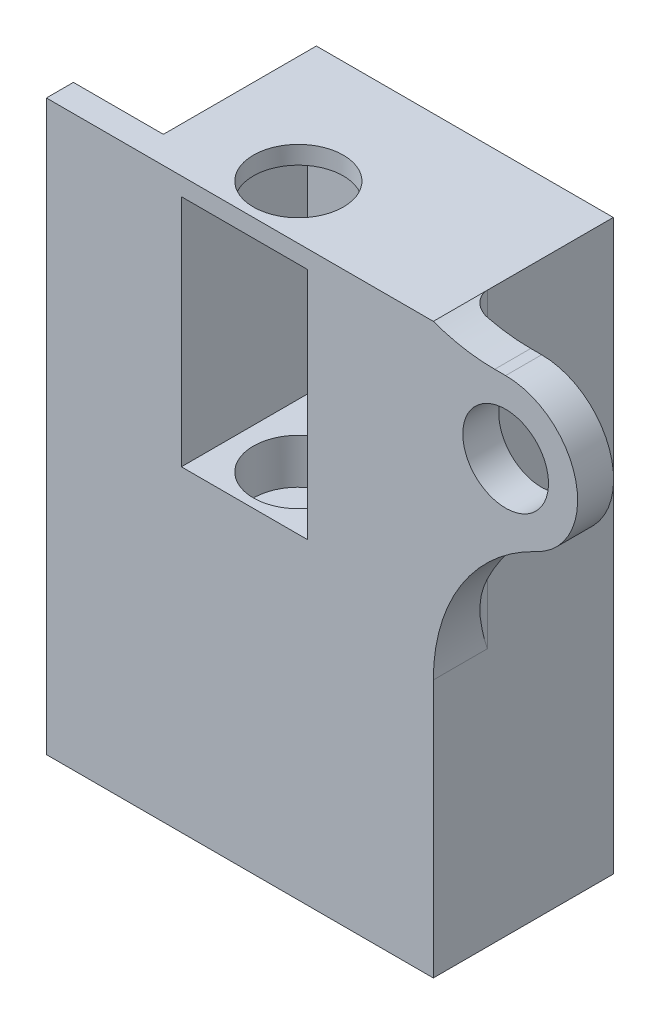
ISO-10303-21;
HEADER;
FILE_DESCRIPTION(('STEP AP214'),'2;1');
FILE_NAME('part.step','',(''),(''),'','','');
FILE_SCHEMA(('AUTOMOTIVE_DESIGN { 1 0 10303 214 1 1 1 1 }'));
ENDSEC;
DATA;
#1=APPLICATION_CONTEXT('core data for automotive mechanical design processes');
#2=APPLICATION_PROTOCOL_DEFINITION('international standard','automotive_design',2000,#1);
#3=PRODUCT_CONTEXT('',#1,'mechanical');
#4=PRODUCT('Part','Part','',(#3));
#5=PRODUCT_RELATED_PRODUCT_CATEGORY('part','',(#4));
#6=PRODUCT_DEFINITION_FORMATION('','',#4);
#7=PRODUCT_DEFINITION_CONTEXT('part definition',#1,'design');
#8=PRODUCT_DEFINITION('design','',#6,#7);
#9=PRODUCT_DEFINITION_SHAPE('','',#8);
#10=(LENGTH_UNIT() NAMED_UNIT(*) SI_UNIT(.MILLI.,.METRE.));
#11=(NAMED_UNIT(*) PLANE_ANGLE_UNIT() SI_UNIT($,.RADIAN.));
#12=(NAMED_UNIT(*) SI_UNIT($,.STERADIAN.) SOLID_ANGLE_UNIT());
#13=UNCERTAINTY_MEASURE_WITH_UNIT(LENGTH_MEASURE(1.E-05),#10,'distance_accuracy_value','');
#14=(GEOMETRIC_REPRESENTATION_CONTEXT(3) GLOBAL_UNCERTAINTY_ASSIGNED_CONTEXT((#13)) GLOBAL_UNIT_ASSIGNED_CONTEXT((#10,
#11,#12)) REPRESENTATION_CONTEXT('',''));
#15=CARTESIAN_POINT('',(0.,0.,0.));
#16=DIRECTION('',(0.,0.,1.));
#17=DIRECTION('',(1.,0.,0.));
#18=AXIS2_PLACEMENT_3D('',#15,#16,#17);
#19=CARTESIAN_POINT('',(0.,0.,0.));
#20=DIRECTION('',(1.,0.,0.));
#21=DIRECTION('',(0.,0.,-1.));
#22=AXIS2_PLACEMENT_3D('',#19,#20,#21);
#23=PLANE('',#22);
#24=DIRECTION('',(0.,0.,1.));
#25=VECTOR('',#24,1.);
#26=CARTESIAN_POINT('',(0.,33.6,-12.));
#27=LINE('',#26,#25);
#28=CARTESIAN_POINT('',(0.,33.6,-10.));
#29=VERTEX_POINT('',#28);
#30=CARTESIAN_POINT('',(0.,33.6,-1.5));
#31=VERTEX_POINT('',#30);
#32=EDGE_CURVE('E636',#29,#31,#27,.T.);
#33=ORIENTED_EDGE('',*,*,#32,.F.);
#34=DIRECTION('',(0.,1.,0.));
#35=VECTOR('',#34,1.);
#36=CARTESIAN_POINT('',(0.,33.6,-10.));
#37=LINE('',#36,#35);
#38=CARTESIAN_POINT('',(0.,2.,-10.));
#39=VERTEX_POINT('',#38);
#40=EDGE_CURVE('E61',#39,#29,#37,.T.);
#41=ORIENTED_EDGE('',*,*,#40,.F.);
#42=DIRECTION('',(0.,0.,1.));
#43=VECTOR('',#42,1.);
#44=CARTESIAN_POINT('',(0.,2.,-12.));
#45=LINE('',#44,#43);
#46=CARTESIAN_POINT('',(0.,2.,-1.5));
#47=VERTEX_POINT('',#46);
#48=EDGE_CURVE('E170',#39,#47,#45,.T.);
#49=ORIENTED_EDGE('',*,*,#48,.T.);
#50=DIRECTION('',(0.,-1.,0.));
#51=VECTOR('',#50,1.);
#52=CARTESIAN_POINT('',(0.,37.1,-1.5));
#53=LINE('',#52,#51);
#54=EDGE_CURVE('E553',#31,#47,#53,.T.);
#55=ORIENTED_EDGE('',*,*,#54,.F.);
#56=EDGE_LOOP('',(#33,#41,#49,#55));
#57=FACE_BOUND('',#56,.T.);
#58=ADVANCED_FACE('F40',(#57),#23,.F.);
#59=CARTESIAN_POINT('',(16.5,0.,0.));
#60=DIRECTION('',(0.,0.,-1.));
#61=DIRECTION('',(-1.,0.,0.));
#62=AXIS2_PLACEMENT_3D('',#59,#60,#61);
#63=PLANE('',#62);
#64=DIRECTION('',(-1.,0.,0.));
#65=VECTOR('',#64,1.);
#66=CARTESIAN_POINT('',(0.,32.6,0.));
#67=LINE('',#66,#65);
#68=CARTESIAN_POINT('',(9.5,32.6,0.));
#69=VERTEX_POINT('',#68);
#70=CARTESIAN_POINT('',(2.5,32.6,0.));
#71=VERTEX_POINT('',#70);
#72=EDGE_CURVE('E596',#69,#71,#67,.T.);
#73=ORIENTED_EDGE('',*,*,#72,.F.);
#74=DIRECTION('',(0.,1.,0.));
#75=VECTOR('',#74,1.);
#76=CARTESIAN_POINT('',(9.5,0.,0.));
#77=LINE('',#76,#75);
#78=CARTESIAN_POINT('',(9.5,19.6,0.));
#79=VERTEX_POINT('',#78);
#80=EDGE_CURVE('E576',#79,#69,#77,.T.);
#81=ORIENTED_EDGE('',*,*,#80,.F.);
#82=DIRECTION('',(1.,0.,0.));
#83=VECTOR('',#82,1.);
#84=CARTESIAN_POINT('',(0.,19.6,0.));
#85=LINE('',#84,#83);
#86=CARTESIAN_POINT('',(2.5,19.6,0.));
#87=VERTEX_POINT('',#86);
#88=EDGE_CURVE('E582',#87,#79,#85,.T.);
#89=ORIENTED_EDGE('',*,*,#88,.F.);
#90=DIRECTION('',(0.,-1.,0.));
#91=VECTOR('',#90,1.);
#92=CARTESIAN_POINT('',(2.50000000000001,0.,0.));
#93=LINE('',#92,#91);
#94=EDGE_CURVE('E600',#71,#87,#93,.T.);
#95=ORIENTED_EDGE('',*,*,#94,.F.);
#96=EDGE_LOOP('',(#73,#81,#89,#95));
#97=FACE_BOUND('',#96,.T.);
#98=CARTESIAN_POINT('',(20.5182193377738,29.,0.));
#99=DIRECTION('',(0.,0.,-1.));
#100=DIRECTION('',(-1.,0.,0.));
#101=AXIS2_PLACEMENT_3D('',#98,#99,#100);
#102=CIRCLE('',#101,2.38125);
#103=CARTESIAN_POINT('',(18.1369693377738,29.,0.));
#104=VERTEX_POINT('',#103);
#105=EDGE_CURVE('E519',#104,#104,#102,.T.);
#106=ORIENTED_EDGE('',*,*,#105,.T.);
#107=EDGE_LOOP('',(#106));
#108=FACE_BOUND('',#107,.T.);
#109=DIRECTION('',(-1.,0.,0.));
#110=VECTOR('',#109,1.);
#111=CARTESIAN_POINT('',(0.,33.,0.));
#112=LINE('',#111,#110);
#113=CARTESIAN_POINT('',(20.5182193377738,33.,0.));
#114=VERTEX_POINT('',#113);
#115=CARTESIAN_POINT('',(19.9117444218464,33.,0.));
#116=VERTEX_POINT('',#115);
#117=EDGE_CURVE('E528',#114,#116,#112,.T.);
#118=ORIENTED_EDGE('',*,*,#117,.T.);
#119=CARTESIAN_POINT('',(19.9117444218464,43.,0.));
#120=DIRECTION('',(0.,0.,-1.));
#121=DIRECTION('',(-1.,0.,0.));
#122=AXIS2_PLACEMENT_3D('',#119,#120,#121);
#123=CIRCLE('',#122,10.);
#124=CARTESIAN_POINT('',(16.5,33.6,0.));
#125=VERTEX_POINT('',#124);
#126=EDGE_CURVE('E206',#116,#125,#123,.T.);
#127=ORIENTED_EDGE('',*,*,#126,.T.);
#128=DIRECTION('',(1.,0.,0.));
#129=VECTOR('',#128,1.);
#130=CARTESIAN_POINT('',(-5.,33.6,0.));
#131=LINE('',#130,#129);
#132=CARTESIAN_POINT('',(-5.,33.6,0.));
#133=VERTEX_POINT('',#132);
#134=EDGE_CURVE('E555',#133,#125,#131,.T.);
#135=ORIENTED_EDGE('',*,*,#134,.F.);
#136=DIRECTION('',(0.,1.,0.));
#137=VECTOR('',#136,1.);
#138=CARTESIAN_POINT('',(-5.,2.,0.));
#139=LINE('',#138,#137);
#140=CARTESIAN_POINT('',(-5.,2.,0.));
#141=VERTEX_POINT('',#140);
#142=EDGE_CURVE('E559',#141,#133,#139,.T.);
#143=ORIENTED_EDGE('',*,*,#142,.F.);
#144=DIRECTION('',(1.,0.,0.));
#145=VECTOR('',#144,1.);
#146=CARTESIAN_POINT('',(0.,2.,0.));
#147=LINE('',#146,#145);
#148=CARTESIAN_POINT('',(16.5,2.,0.));
#149=VERTEX_POINT('',#148);
#150=EDGE_CURVE('E183',#141,#149,#147,.T.);
#151=ORIENTED_EDGE('',*,*,#150,.T.);
#152=DIRECTION('',(0.,-1.,0.));
#153=VECTOR('',#152,1.);
#154=CARTESIAN_POINT('',(16.5,0.,0.));
#155=LINE('',#154,#153);
#156=CARTESIAN_POINT('',(16.5,16.342263231169,0.));
#157=VERTEX_POINT('',#156);
#158=EDGE_CURVE('E176',#157,#149,#155,.T.);
#159=ORIENTED_EDGE('',*,*,#158,.F.);
#160=CARTESIAN_POINT('',(26.5,16.342263231169,0.));
#161=DIRECTION('',(0.,0.,-1.));
#162=DIRECTION('',(-1.,0.,0.));
#163=AXIS2_PLACEMENT_3D('',#160,#161,#162);
#164=CIRCLE('',#163,10.);
#165=CARTESIAN_POINT('',(22.2272995269813,25.383503780334,0.));
#166=VERTEX_POINT('',#165);
#167=EDGE_CURVE('E218',#157,#166,#164,.T.);
#168=ORIENTED_EDGE('',*,*,#167,.T.);
#169=CARTESIAN_POINT('',(20.5182193377738,29.,0.));
#170=DIRECTION('',(0.,0.,1.));
#171=DIRECTION('',(1.,0.,0.));
#172=AXIS2_PLACEMENT_3D('',#169,#170,#171);
#173=CIRCLE('',#172,4.);
#174=EDGE_CURVE('E523',#114,#166,#173,.F.);
#175=ORIENTED_EDGE('',*,*,#174,.F.);
#176=EDGE_LOOP('',(#118,#127,#135,#143,#151,#159,#168,#175));
#177=FACE_BOUND('',#176,.T.);
#178=ADVANCED_FACE('F246',(#97,#108,#177),#63,.F.);
#179=CARTESIAN_POINT('',(16.5,0.,0.));
#180=DIRECTION('',(1.,0.,0.));
#181=DIRECTION('',(0.,0.,-1.));
#182=AXIS2_PLACEMENT_3D('',#179,#180,#181);
#183=PLANE('',#182);
#184=DIRECTION('',(0.,-1.,0.));
#185=VECTOR('',#184,1.);
#186=CARTESIAN_POINT('',(16.5,2.,-10.));
#187=LINE('',#186,#185);
#188=CARTESIAN_POINT('',(16.5,33.6,-10.));
#189=VERTEX_POINT('',#188);
#190=CARTESIAN_POINT('',(16.5,2.,-10.));
#191=VERTEX_POINT('',#190);
#192=EDGE_CURVE('E155',#189,#191,#187,.T.);
#193=ORIENTED_EDGE('',*,*,#192,.F.);
#194=DIRECTION('',(0.,0.,-1.));
#195=VECTOR('',#194,1.);
#196=CARTESIAN_POINT('',(16.5,33.6,0.));
#197=LINE('',#196,#195);
#198=CARTESIAN_POINT('',(16.5,33.6,-3.));
#199=VERTEX_POINT('',#198);
#200=EDGE_CURVE('E548',#199,#189,#197,.T.);
#201=ORIENTED_EDGE('',*,*,#200,.F.);
#202=DIRECTION('',(0.,1.,0.));
#203=VECTOR('',#202,1.);
#204=CARTESIAN_POINT('',(16.5,0.,-3.));
#205=LINE('',#204,#203);
#206=CARTESIAN_POINT('',(16.5,16.342263231169,-3.));
#207=VERTEX_POINT('',#206);
#208=EDGE_CURVE('E229',#199,#207,#205,.F.);
#209=ORIENTED_EDGE('',*,*,#208,.T.);
#210=DIRECTION('',(0.,0.,1.));
#211=VECTOR('',#210,1.);
#212=CARTESIAN_POINT('',(16.5,16.342263231169,0.));
#213=LINE('',#212,#211);
#214=EDGE_CURVE('E212',#207,#157,#213,.T.);
#215=ORIENTED_EDGE('',*,*,#214,.T.);
#216=ORIENTED_EDGE('',*,*,#158,.T.);
#217=DIRECTION('',(0.,0.,1.));
#218=VECTOR('',#217,1.);
#219=CARTESIAN_POINT('',(16.5,2.,-12.));
#220=LINE('',#219,#218);
#221=EDGE_CURVE('E167',#191,#149,#220,.T.);
#222=ORIENTED_EDGE('',*,*,#221,.F.);
#223=EDGE_LOOP('',(#193,#201,#209,#215,#216,#222));
#224=FACE_BOUND('',#223,.T.);
#225=ADVANCED_FACE('F173',(#224),#183,.T.);
#226=CARTESIAN_POINT('',(0.,2.,-12.));
#227=DIRECTION('',(0.,1.,0.));
#228=DIRECTION('',(0.,0.,1.));
#229=AXIS2_PLACEMENT_3D('',#226,#227,#228);
#230=PLANE('',#229);
#231=CARTESIAN_POINT('',(8.25,2.,-6.));
#232=DIRECTION('',(0.,-1.,0.));
#233=DIRECTION('',(0.,0.,-1.));
#234=AXIS2_PLACEMENT_3D('',#231,#232,#233);
#235=CIRCLE('',#234,2.38125);
#236=CARTESIAN_POINT('',(8.25,2.,-8.38125));
#237=VERTEX_POINT('',#236);
#238=EDGE_CURVE('E502',#237,#237,#235,.T.);
#239=ORIENTED_EDGE('',*,*,#238,.F.);
#240=EDGE_LOOP('',(#239));
#241=FACE_BOUND('',#240,.T.);
#242=ORIENTED_EDGE('',*,*,#48,.F.);
#243=DIRECTION('',(-1.,0.,0.));
#244=VECTOR('',#243,1.);
#245=CARTESIAN_POINT('',(0.,2.,-10.));
#246=LINE('',#245,#244);
#247=EDGE_CURVE('E158',#191,#39,#246,.T.);
#248=ORIENTED_EDGE('',*,*,#247,.F.);
#249=ORIENTED_EDGE('',*,*,#221,.T.);
#250=ORIENTED_EDGE('',*,*,#150,.F.);
#251=DIRECTION('',(0.,0.,1.));
#252=VECTOR('',#251,1.);
#253=CARTESIAN_POINT('',(-5.,2.,-1.5));
#254=LINE('',#253,#252);
#255=CARTESIAN_POINT('',(-5.,2.,-1.5));
#256=VERTEX_POINT('',#255);
#257=EDGE_CURVE('E566',#256,#141,#254,.T.);
#258=ORIENTED_EDGE('',*,*,#257,.F.);
#259=DIRECTION('',(1.,0.,0.));
#260=VECTOR('',#259,1.);
#261=CARTESIAN_POINT('',(-5.,2.,-1.5));
#262=LINE('',#261,#260);
#263=EDGE_CURVE('E570',#256,#47,#262,.T.);
#264=ORIENTED_EDGE('',*,*,#263,.T.);
#265=EDGE_LOOP('',(#242,#248,#249,#250,#258,#264));
#266=FACE_BOUND('',#265,.T.);
#267=ADVANCED_FACE('F166',(#241,#266),#230,.F.);
#268=CARTESIAN_POINT('',(20.5182193377738,29.,-2.));
#269=DIRECTION('',(0.,0.,1.));
#270=DIRECTION('',(1.,0.,0.));
#271=AXIS2_PLACEMENT_3D('',#268,#269,#270);
#272=CYLINDRICAL_SURFACE('',#271,4.);
#273=ORIENTED_EDGE('',*,*,#174,.T.);
#274=DIRECTION('',(0.,0.,1.));
#275=VECTOR('',#274,1.);
#276=CARTESIAN_POINT('',(22.2272995269813,25.383503780334,-2.));
#277=LINE('',#276,#275);
#278=CARTESIAN_POINT('',(22.2272995269813,25.383503780334,-2.));
#279=VERTEX_POINT('',#278);
#280=EDGE_CURVE('E215',#166,#279,#277,.F.);
#281=ORIENTED_EDGE('',*,*,#280,.T.);
#282=CARTESIAN_POINT('',(20.5182193377738,29.,-2.));
#283=DIRECTION('',(0.,0.,1.));
#284=DIRECTION('',(1.,0.,0.));
#285=AXIS2_PLACEMENT_3D('',#282,#283,#284);
#286=CIRCLE('',#285,4.);
#287=CARTESIAN_POINT('',(20.5182193377738,33.,-2.));
#288=VERTEX_POINT('',#287);
#289=EDGE_CURVE('E524',#288,#279,#286,.F.);
#290=ORIENTED_EDGE('',*,*,#289,.F.);
#291=DIRECTION('',(0.,0.,1.));
#292=VECTOR('',#291,1.);
#293=CARTESIAN_POINT('',(20.5182193377738,33.,-2.));
#294=LINE('',#293,#292);
#295=EDGE_CURVE('E179',#288,#114,#294,.T.);
#296=ORIENTED_EDGE('',*,*,#295,.T.);
#297=EDGE_LOOP('',(#273,#281,#290,#296));
#298=FACE_BOUND('',#297,.T.);
#299=ADVANCED_FACE('F269',(#298),#272,.T.);
#300=CARTESIAN_POINT('',(0.,33.,-2.));
#301=DIRECTION('',(0.,1.,0.));
#302=DIRECTION('',(0.,0.,1.));
#303=AXIS2_PLACEMENT_3D('',#300,#301,#302);
#304=PLANE('',#303);
#305=DIRECTION('',(-1.,0.,0.));
#306=VECTOR('',#305,1.);
#307=CARTESIAN_POINT('',(0.,33.,-2.));
#308=LINE('',#307,#306);
#309=CARTESIAN_POINT('',(19.9117444218464,33.,-2.));
#310=VERTEX_POINT('',#309);
#311=EDGE_CURVE('E185',#288,#310,#308,.T.);
#312=ORIENTED_EDGE('',*,*,#311,.T.);
#313=DIRECTION('',(0.,0.,1.));
#314=VECTOR('',#313,1.);
#315=CARTESIAN_POINT('',(19.9117444218464,33.,0.));
#316=LINE('',#315,#314);
#317=EDGE_CURVE('E192',#310,#116,#316,.T.);
#318=ORIENTED_EDGE('',*,*,#317,.T.);
#319=ORIENTED_EDGE('',*,*,#117,.F.);
#320=ORIENTED_EDGE('',*,*,#295,.F.);
#321=EDGE_LOOP('',(#312,#318,#319,#320));
#322=FACE_BOUND('',#321,.T.);
#323=ADVANCED_FACE('F273',(#322),#304,.T.);
#324=CARTESIAN_POINT('',(0.,0.,-2.));
#325=DIRECTION('',(0.,0.,1.));
#326=DIRECTION('',(1.,0.,0.));
#327=AXIS2_PLACEMENT_3D('',#324,#325,#326);
#328=PLANE('',#327);
#329=CARTESIAN_POINT('',(20.5182193377738,29.,-2.));
#330=DIRECTION('',(0.,0.,-1.));
#331=DIRECTION('',(-1.,0.,0.));
#332=AXIS2_PLACEMENT_3D('',#329,#330,#331);
#333=CIRCLE('',#332,2.38125);
#334=CARTESIAN_POINT('',(18.1369693377738,29.,-2.));
#335=VERTEX_POINT('',#334);
#336=EDGE_CURVE('E514',#335,#335,#333,.T.);
#337=ORIENTED_EDGE('',*,*,#336,.F.);
#338=EDGE_LOOP('',(#337));
#339=FACE_BOUND('',#338,.T.);
#340=CARTESIAN_POINT('',(26.5,16.342263231169,-2.));
#341=DIRECTION('',(0.,0.,1.));
#342=DIRECTION('',(1.,0.,0.));
#343=AXIS2_PLACEMENT_3D('',#340,#341,#342);
#344=CIRCLE('',#343,10.);
#345=CARTESIAN_POINT('',(17.5,20.7011621747097,-2.));
#346=VERTEX_POINT('',#345);
#347=EDGE_CURVE('E221',#279,#346,#344,.T.);
#348=ORIENTED_EDGE('',*,*,#347,.T.);
#349=DIRECTION('',(0.,1.,0.));
#350=VECTOR('',#349,1.);
#351=CARTESIAN_POINT('',(17.5,0.,-2.));
#352=LINE('',#351,#350);
#353=CARTESIAN_POINT('',(17.5,33.2951821839,-2.));
#354=VERTEX_POINT('',#353);
#355=EDGE_CURVE('E225',#346,#354,#352,.T.);
#356=ORIENTED_EDGE('',*,*,#355,.T.);
#357=CARTESIAN_POINT('',(19.9117444218464,43.,-2.));
#358=DIRECTION('',(0.,0.,1.));
#359=DIRECTION('',(1.,0.,0.));
#360=AXIS2_PLACEMENT_3D('',#357,#358,#359);
#361=CIRCLE('',#360,10.);
#362=EDGE_CURVE('E209',#354,#310,#361,.T.);
#363=ORIENTED_EDGE('',*,*,#362,.T.);
#364=ORIENTED_EDGE('',*,*,#311,.F.);
#365=ORIENTED_EDGE('',*,*,#289,.T.);
#366=EDGE_LOOP('',(#348,#356,#363,#364,#365));
#367=FACE_BOUND('',#366,.T.);
#368=ADVANCED_FACE('F277',(#339,#367),#328,.F.);
#369=CARTESIAN_POINT('',(20.5182193377738,29.,10.6066017177982));
#370=DIRECTION('',(0.,0.,-1.));
#371=DIRECTION('',(-1.,0.,0.));
#372=AXIS2_PLACEMENT_3D('',#369,#370,#371);
#373=CYLINDRICAL_SURFACE('',#372,2.38125);
#374=ORIENTED_EDGE('',*,*,#336,.T.);
#375=EDGE_LOOP('',(#374));
#376=FACE_BOUND('',#375,.T.);
#377=ORIENTED_EDGE('',*,*,#105,.F.);
#378=EDGE_LOOP('',(#377));
#379=FACE_BOUND('',#378,.T.);
#380=ADVANCED_FACE('F281',(#376,#379),#373,.F.);
#381=CARTESIAN_POINT('',(8.25,8.35,-6.));
#382=DIRECTION('',(0.,-1.,0.));
#383=DIRECTION('',(0.,0.,-1.));
#384=AXIS2_PLACEMENT_3D('',#381,#382,#383);
#385=CYLINDRICAL_SURFACE('',#384,2.38125);
#386=CARTESIAN_POINT('',(8.25,8.35,-6.));
#387=DIRECTION('',(0.,-1.,0.));
#388=DIRECTION('',(0.,0.,-1.));
#389=AXIS2_PLACEMENT_3D('',#386,#387,#388);
#390=CIRCLE('',#389,2.38125);
#391=CARTESIAN_POINT('',(8.25,8.35,-8.38125));
#392=VERTEX_POINT('',#391);
#393=EDGE_CURVE('E506',#392,#392,#390,.T.);
#394=ORIENTED_EDGE('',*,*,#393,.F.);
#395=EDGE_LOOP('',(#394));
#396=FACE_BOUND('',#395,.T.);
#397=ORIENTED_EDGE('',*,*,#238,.T.);
#398=EDGE_LOOP('',(#397));
#399=FACE_BOUND('',#398,.T.);
#400=ADVANCED_FACE('F285',(#396,#399),#385,.F.);
#401=CARTESIAN_POINT('',(0.,8.35,0.));
#402=DIRECTION('',(0.,-1.,0.));
#403=DIRECTION('',(0.,0.,-1.));
#404=AXIS2_PLACEMENT_3D('',#401,#402,#403);
#405=PLANE('',#404);
#406=ORIENTED_EDGE('',*,*,#393,.T.);
#407=EDGE_LOOP('',(#406));
#408=FACE_BOUND('',#407,.T.);
#409=ADVANCED_FACE('F289',(#408),#405,.T.);
#410=CARTESIAN_POINT('',(6.,17.1,-3.));
#411=DIRECTION('',(0.,1.,0.));
#412=DIRECTION('',(0.,0.,1.));
#413=AXIS2_PLACEMENT_3D('',#410,#411,#412);
#414=CYLINDRICAL_SURFACE('',#413,2.5);
#415=CARTESIAN_POINT('',(6.,33.6,-3.));
#416=DIRECTION('',(0.,-1.,0.));
#417=DIRECTION('',(0.,0.,-1.));
#418=AXIS2_PLACEMENT_3D('',#415,#416,#417);
#419=CIRCLE('',#418,2.5);
#420=CARTESIAN_POINT('',(6.,33.6,-5.5));
#421=VERTEX_POINT('',#420);
#422=EDGE_CURVE('E547',#421,#421,#419,.F.);
#423=ORIENTED_EDGE('',*,*,#422,.T.);
#424=EDGE_LOOP('',(#423));
#425=FACE_BOUND('',#424,.T.);
#426=CARTESIAN_POINT('',(6.,32.6,-3.));
#427=DIRECTION('',(0.,1.,0.));
#428=DIRECTION('',(0.,0.,1.));
#429=AXIS2_PLACEMENT_3D('',#426,#427,#428);
#430=CIRCLE('',#429,2.5);
#431=CARTESIAN_POINT('',(6.,32.6,-0.5));
#432=VERTEX_POINT('',#431);
#433=EDGE_CURVE('E193',#432,#432,#430,.F.);
#434=ORIENTED_EDGE('',*,*,#433,.T.);
#435=EDGE_LOOP('',(#434));
#436=FACE_BOUND('',#435,.T.);
#437=ADVANCED_FACE('F293',(#425,#436),#414,.F.);
#438=CARTESIAN_POINT('',(0.,19.6,-7.));
#439=DIRECTION('',(0.,-1.,0.));
#440=DIRECTION('',(0.,0.,-1.));
#441=AXIS2_PLACEMENT_3D('',#438,#439,#440);
#442=PLANE('',#441);
#443=ORIENTED_EDGE('',*,*,#88,.T.);
#444=DIRECTION('',(0.,0.,1.));
#445=VECTOR('',#444,1.);
#446=CARTESIAN_POINT('',(9.5,19.6,-7.));
#447=LINE('',#446,#445);
#448=CARTESIAN_POINT('',(9.5,19.6,-7.));
#449=VERTEX_POINT('',#448);
#450=EDGE_CURVE('E198',#449,#79,#447,.T.);
#451=ORIENTED_EDGE('',*,*,#450,.F.);
#452=DIRECTION('',(1.,0.,0.));
#453=VECTOR('',#452,1.);
#454=CARTESIAN_POINT('',(0.,19.6,-7.));
#455=LINE('',#454,#453);
#456=CARTESIAN_POINT('',(2.5,19.6,-7.));
#457=VERTEX_POINT('',#456);
#458=EDGE_CURVE('E590',#457,#449,#455,.T.);
#459=ORIENTED_EDGE('',*,*,#458,.F.);
#460=DIRECTION('',(0.,0.,1.));
#461=VECTOR('',#460,1.);
#462=CARTESIAN_POINT('',(2.5,19.6,-7.));
#463=LINE('',#462,#461);
#464=EDGE_CURVE('E609',#457,#87,#463,.T.);
#465=ORIENTED_EDGE('',*,*,#464,.T.);
#466=EDGE_LOOP('',(#443,#451,#459,#465));
#467=FACE_BOUND('',#466,.T.);
#468=CARTESIAN_POINT('',(6.,19.6,-3.));
#469=DIRECTION('',(0.,-1.,0.));
#470=DIRECTION('',(0.,0.,-1.));
#471=AXIS2_PLACEMENT_3D('',#468,#469,#470);
#472=CIRCLE('',#471,2.5);
#473=CARTESIAN_POINT('',(6.,19.6,-5.5));
#474=VERTEX_POINT('',#473);
#475=EDGE_CURVE('E197',#474,#474,#472,.F.);
#476=ORIENTED_EDGE('',*,*,#475,.F.);
#477=EDGE_LOOP('',(#476));
#478=FACE_BOUND('',#477,.T.);
#479=ADVANCED_FACE('F297',(#467,#478),#442,.F.);
#480=CARTESIAN_POINT('',(0.,32.6,-7.));
#481=DIRECTION('',(0.,1.,0.));
#482=DIRECTION('',(0.,0.,1.));
#483=AXIS2_PLACEMENT_3D('',#480,#481,#482);
#484=PLANE('',#483);
#485=ORIENTED_EDGE('',*,*,#72,.T.);
#486=DIRECTION('',(0.,0.,1.));
#487=VECTOR('',#486,1.);
#488=CARTESIAN_POINT('',(2.5,32.6,-7.));
#489=LINE('',#488,#487);
#490=CARTESIAN_POINT('',(2.5,32.6,-7.));
#491=VERTEX_POINT('',#490);
#492=EDGE_CURVE('E611',#491,#71,#489,.T.);
#493=ORIENTED_EDGE('',*,*,#492,.F.);
#494=DIRECTION('',(-1.,0.,0.));
#495=VECTOR('',#494,1.);
#496=CARTESIAN_POINT('',(0.,32.6,-7.));
#497=LINE('',#496,#495);
#498=CARTESIAN_POINT('',(9.5,32.6,-7.));
#499=VERTEX_POINT('',#498);
#500=EDGE_CURVE('E581',#499,#491,#497,.T.);
#501=ORIENTED_EDGE('',*,*,#500,.F.);
#502=DIRECTION('',(0.,0.,1.));
#503=VECTOR('',#502,1.);
#504=CARTESIAN_POINT('',(9.5,32.6,-7.));
#505=LINE('',#504,#503);
#506=EDGE_CURVE('E510',#499,#69,#505,.T.);
#507=ORIENTED_EDGE('',*,*,#506,.T.);
#508=EDGE_LOOP('',(#485,#493,#501,#507));
#509=FACE_BOUND('',#508,.T.);
#510=ORIENTED_EDGE('',*,*,#433,.F.);
#511=EDGE_LOOP('',(#510));
#512=FACE_BOUND('',#511,.T.);
#513=ADVANCED_FACE('F309',(#509,#512),#484,.F.);
#514=CARTESIAN_POINT('',(9.5,0.,-7.));
#515=DIRECTION('',(1.,0.,0.));
#516=DIRECTION('',(0.,0.,-1.));
#517=AXIS2_PLACEMENT_3D('',#514,#515,#516);
#518=PLANE('',#517);
#519=ORIENTED_EDGE('',*,*,#80,.T.);
#520=ORIENTED_EDGE('',*,*,#506,.F.);
#521=DIRECTION('',(0.,1.,0.));
#522=VECTOR('',#521,1.);
#523=CARTESIAN_POINT('',(9.5,0.,-7.));
#524=LINE('',#523,#522);
#525=EDGE_CURVE('E577',#449,#499,#524,.T.);
#526=ORIENTED_EDGE('',*,*,#525,.F.);
#527=ORIENTED_EDGE('',*,*,#450,.T.);
#528=EDGE_LOOP('',(#519,#520,#526,#527));
#529=FACE_BOUND('',#528,.T.);
#530=ADVANCED_FACE('F305',(#529),#518,.F.);
#531=CARTESIAN_POINT('',(2.50000000000001,0.,-7.));
#532=DIRECTION('',(-1.,0.,0.));
#533=DIRECTION('',(0.,-1.,0.));
#534=AXIS2_PLACEMENT_3D('',#531,#532,#533);
#535=PLANE('',#534);
#536=ORIENTED_EDGE('',*,*,#94,.T.);
#537=ORIENTED_EDGE('',*,*,#464,.F.);
#538=DIRECTION('',(0.,-1.,0.));
#539=VECTOR('',#538,1.);
#540=CARTESIAN_POINT('',(2.50000000000001,0.,-7.));
#541=LINE('',#540,#539);
#542=EDGE_CURVE('E586',#491,#457,#541,.T.);
#543=ORIENTED_EDGE('',*,*,#542,.F.);
#544=ORIENTED_EDGE('',*,*,#492,.T.);
#545=EDGE_LOOP('',(#536,#537,#543,#544));
#546=FACE_BOUND('',#545,.T.);
#547=ADVANCED_FACE('F308',(#546),#535,.F.);
#548=CARTESIAN_POINT('',(0.,0.,-7.));
#549=DIRECTION('',(0.,0.,1.));
#550=DIRECTION('',(1.,0.,0.));
#551=AXIS2_PLACEMENT_3D('',#548,#549,#550);
#552=PLANE('',#551);
#553=ORIENTED_EDGE('',*,*,#525,.T.);
#554=ORIENTED_EDGE('',*,*,#500,.T.);
#555=ORIENTED_EDGE('',*,*,#542,.T.);
#556=ORIENTED_EDGE('',*,*,#458,.T.);
#557=EDGE_LOOP('',(#553,#554,#555,#556));
#558=FACE_BOUND('',#557,.T.);
#559=ADVANCED_FACE('F303',(#558),#552,.T.);
#560=CARTESIAN_POINT('',(0.,17.1,0.));
#561=DIRECTION('',(0.,1.,0.));
#562=DIRECTION('',(0.,0.,1.));
#563=AXIS2_PLACEMENT_3D('',#560,#561,#562);
#564=PLANE('',#563);
#565=CARTESIAN_POINT('',(6.,17.1,-3.));
#566=DIRECTION('',(0.,1.,0.));
#567=DIRECTION('',(0.,0.,1.));
#568=AXIS2_PLACEMENT_3D('',#565,#566,#567);
#569=CIRCLE('',#568,2.5);
#570=CARTESIAN_POINT('',(6.,17.1,-0.5));
#571=VERTEX_POINT('',#570);
#572=EDGE_CURVE('E202',#571,#571,#569,.T.);
#573=ORIENTED_EDGE('',*,*,#572,.T.);
#574=EDGE_LOOP('',(#573));
#575=FACE_BOUND('',#574,.T.);
#576=ADVANCED_FACE('F300',(#575),#564,.T.);
#577=ORIENTED_EDGE('',*,*,#475,.T.);
#578=EDGE_LOOP('',(#577));
#579=FACE_BOUND('',#578,.T.);
#580=ORIENTED_EDGE('',*,*,#572,.F.);
#581=EDGE_LOOP('',(#580));
#582=FACE_BOUND('',#581,.T.);
#583=ADVANCED_FACE('F299',(#579,#582),#414,.F.);
#584=CARTESIAN_POINT('',(-5.,37.1,-1.5));
#585=DIRECTION('',(0.,0.,1.));
#586=DIRECTION('',(0.,-1.,0.));
#587=AXIS2_PLACEMENT_3D('',#584,#585,#586);
#588=PLANE('',#587);
#589=DIRECTION('',(0.,-1.,0.));
#590=VECTOR('',#589,1.);
#591=CARTESIAN_POINT('',(-5.,37.1,-1.5));
#592=LINE('',#591,#590);
#593=CARTESIAN_POINT('',(-5.,33.6,-1.5));
#594=VERTEX_POINT('',#593);
#595=EDGE_CURVE('E563',#594,#256,#592,.T.);
#596=ORIENTED_EDGE('',*,*,#595,.F.);
#597=DIRECTION('',(-1.,0.,0.));
#598=VECTOR('',#597,1.);
#599=CARTESIAN_POINT('',(0.,33.6,-1.5));
#600=LINE('',#599,#598);
#601=EDGE_CURVE('E635',#31,#594,#600,.T.);
#602=ORIENTED_EDGE('',*,*,#601,.F.);
#603=ORIENTED_EDGE('',*,*,#54,.T.);
#604=ORIENTED_EDGE('',*,*,#263,.F.);
#605=EDGE_LOOP('',(#596,#602,#603,#604));
#606=FACE_BOUND('',#605,.T.);
#607=ADVANCED_FACE('F323',(#606),#588,.F.);
#608=CARTESIAN_POINT('',(-5.,0.,0.));
#609=DIRECTION('',(-1.,0.,0.));
#610=DIRECTION('',(0.,0.,1.));
#611=AXIS2_PLACEMENT_3D('',#608,#609,#610);
#612=PLANE('',#611);
#613=DIRECTION('',(0.,0.,1.));
#614=VECTOR('',#613,1.);
#615=CARTESIAN_POINT('',(-5.,33.6,-1.5));
#616=LINE('',#615,#614);
#617=EDGE_CURVE('E645',#594,#133,#616,.T.);
#618=ORIENTED_EDGE('',*,*,#617,.F.);
#619=ORIENTED_EDGE('',*,*,#595,.T.);
#620=ORIENTED_EDGE('',*,*,#257,.T.);
#621=ORIENTED_EDGE('',*,*,#142,.T.);
#622=EDGE_LOOP('',(#618,#619,#620,#621));
#623=FACE_BOUND('',#622,.T.);
#624=ADVANCED_FACE('F326',(#623),#612,.T.);
#625=CARTESIAN_POINT('',(0.,33.6,0.));
#626=DIRECTION('',(0.,-1.,0.));
#627=DIRECTION('',(0.,0.,-1.));
#628=AXIS2_PLACEMENT_3D('',#625,#626,#627);
#629=PLANE('',#628);
#630=ORIENTED_EDGE('',*,*,#200,.T.);
#631=DIRECTION('',(1.,0.,0.));
#632=VECTOR('',#631,1.);
#633=CARTESIAN_POINT('',(16.5,33.6,-10.));
#634=LINE('',#633,#632);
#635=EDGE_CURVE('E159',#29,#189,#634,.T.);
#636=ORIENTED_EDGE('',*,*,#635,.F.);
#637=ORIENTED_EDGE('',*,*,#32,.T.);
#638=ORIENTED_EDGE('',*,*,#601,.T.);
#639=ORIENTED_EDGE('',*,*,#617,.T.);
#640=ORIENTED_EDGE('',*,*,#134,.T.);
#641=EDGE_CURVE('E69',#125,#199,#197,.T.);
#642=ORIENTED_EDGE('',*,*,#641,.T.);
#643=EDGE_LOOP('',(#630,#636,#637,#638,#639,#640,#642));
#644=FACE_BOUND('',#643,.T.);
#645=ORIENTED_EDGE('',*,*,#422,.F.);
#646=EDGE_LOOP('',(#645));
#647=FACE_BOUND('',#646,.T.);
#648=ADVANCED_FACE('F244',(#644,#647),#629,.F.);
#649=CARTESIAN_POINT('',(19.9117444218464,43.,0.));
#650=DIRECTION('',(0.,0.,-1.));
#651=DIRECTION('',(-1.,0.,0.));
#652=AXIS2_PLACEMENT_3D('',#649,#650,#651);
#653=CYLINDRICAL_SURFACE('',#652,10.);
#654=ORIENTED_EDGE('',*,*,#362,.F.);
#655=CARTESIAN_POINT('',(17.5,33.2951821839,-2.));
#656=CARTESIAN_POINT('',(17.4416882046076,33.3096521513916,-1.99996377159555));
#657=CARTESIAN_POINT('',(17.3835448570359,33.3246797672575,-2.00509729641203));
#658=CARTESIAN_POINT('',(17.2691894306341,33.3552970068834,-2.02528178802682));
#659=CARTESIAN_POINT('',(17.2129763122904,33.370886318572,-2.04032732575709));
#660=CARTESIAN_POINT('',(17.1039998442129,33.4020931624776,-2.07991778830303));
#661=CARTESIAN_POINT('',(17.0512370422384,33.417710698773,-2.10446421718611));
#662=CARTESIAN_POINT('',(16.9506212007074,33.4483242872222,-2.16241344629458));
#663=CARTESIAN_POINT('',(16.9027678199665,33.4633203825204,-2.19581563050275));
#664=CARTESIAN_POINT('',(16.8133948734528,33.4919804261872,-2.27063887890849));
#665=CARTESIAN_POINT('',(16.7718704395181,33.5056453954947,-2.31205372362896));
#666=CARTESIAN_POINT('',(16.6964431848553,33.5309227438538,-2.40189151600445));
#667=CARTESIAN_POINT('',(16.6625404522537,33.5425350991717,-2.45031454468144));
#668=CARTESIAN_POINT('',(16.6046947097274,33.5626100803941,-2.55092090933748));
#669=CARTESIAN_POINT('',(16.5804299370159,33.5711732462641,-2.60289915195508));
#670=CARTESIAN_POINT('',(16.5410873005675,33.5851653108669,-2.71058607085887));
#671=CARTESIAN_POINT('',(16.5259962909772,33.590598693939,-2.76628928157378));
#672=CARTESIAN_POINT('',(16.5105487685177,33.5961765065227,-2.85211540040821));
#673=CARTESIAN_POINT('',(16.5065958447039,33.5976080034534,-2.88155237267648));
#674=CARTESIAN_POINT('',(16.5013224671775,33.5995199180946,-2.94065406686891));
#675=CARTESIAN_POINT('',(16.4999986917682,33.600001535888,-2.97031845382046));
#676=CARTESIAN_POINT('',(16.5,33.6,-3.));
#677=B_SPLINE_CURVE_WITH_KNOTS('',3,(#655,#656,#657,#658,#659,#660,#661,#662,#663,#664,#665,
#666,#667,#668,#669,#670,#671,#672,#673,#674,#675,#676),.UNSPECIFIED.,.F.,.F.,(4,2,2,2,2,2,2,2,
2,2,4),(0.,0.179979391065258,0.359860284590325,0.539769666360691,0.719666536695732,
0.899424326151548,1.07918419396243,1.25230100574518,1.42516915555092,1.51425951775296,
1.60323725036706),.UNSPECIFIED.);
#678=EDGE_CURVE('E54',#354,#199,#677,.T.);
#679=ORIENTED_EDGE('',*,*,#678,.T.);
#680=ORIENTED_EDGE('',*,*,#641,.F.);
#681=ORIENTED_EDGE('',*,*,#126,.F.);
#682=ORIENTED_EDGE('',*,*,#317,.F.);
#683=EDGE_LOOP('',(#654,#679,#680,#681,#682));
#684=FACE_BOUND('',#683,.T.);
#685=ADVANCED_FACE('F239',(#684),#653,.F.);
#686=CARTESIAN_POINT('',(26.5,16.342263231169,-2.));
#687=DIRECTION('',(0.,0.,1.));
#688=DIRECTION('',(1.,0.,0.));
#689=AXIS2_PLACEMENT_3D('',#686,#687,#688);
#690=CYLINDRICAL_SURFACE('',#689,10.);
#691=ORIENTED_EDGE('',*,*,#347,.F.);
#692=ORIENTED_EDGE('',*,*,#280,.F.);
#693=ORIENTED_EDGE('',*,*,#167,.F.);
#694=ORIENTED_EDGE('',*,*,#214,.F.);
#695=CARTESIAN_POINT('',(17.5,20.7011621747097,-2.));
#696=CARTESIAN_POINT('',(17.4649705918882,20.6288396959497,-2.00001517907888));
#697=CARTESIAN_POINT('',(17.4308249738421,20.556111587016,-2.00183974990828));
#698=CARTESIAN_POINT('',(17.3643618176126,20.4100074789031,-2.00867500405915));
#699=CARTESIAN_POINT('',(17.3320435036572,20.336631770189,-2.01368432408378));
#700=CARTESIAN_POINT('',(17.2693266347427,20.1894773913306,-2.02644469931918));
#701=CARTESIAN_POINT('',(17.2389244580283,20.1156997864008,-2.03419038738089));
#702=CARTESIAN_POINT('',(17.1799867691033,19.9676874000717,-2.05208658188006));
#703=CARTESIAN_POINT('',(17.1514514850332,19.8934525640055,-2.06223738153228));
#704=CARTESIAN_POINT('',(17.0688926274996,19.6708057930277,-2.09574919733705));
#705=CARTESIAN_POINT('',(17.017647311377,19.5218199539269,-2.12222969644671));
#706=CARTESIAN_POINT('',(16.9225479634451,19.2227266295524,-2.18165298985507));
#707=CARTESIAN_POINT('',(16.8786986935253,19.0726184861419,-2.21459991820859));
#708=CARTESIAN_POINT('',(16.7820109335453,18.7105191846494,-2.29987772594522));
#709=CARTESIAN_POINT('',(16.732746945945,18.4981381547551,-2.35464870463528));
#710=CARTESIAN_POINT('',(16.6484261900647,18.0724702024824,-2.47087286474006));
#711=CARTESIAN_POINT('',(16.6133715529952,17.8591831490567,-2.53232704679311));
#712=CARTESIAN_POINT('',(16.5291314236184,17.2182827355187,-2.72300296786534));
#713=CARTESIAN_POINT('',(16.5008343674646,16.7894961375238,-2.85857288785149));
#714=CARTESIAN_POINT('',(16.5000060646769,16.3549759307317,-2.99597991124583));
#715=CARTESIAN_POINT('',(16.5000000044712,16.3486195087201,-2.99798998882368));
#716=CARTESIAN_POINT('',(16.5,16.342263231169,-3.));
#717=B_SPLINE_CURVE_WITH_KNOTS('',3,(#695,#696,#697,#698,#699,#700,#701,#702,#703,#704,#705,
#706,#707,#708,#709,#710,#711,#712,#713,#714,#715,#716),.UNSPECIFIED.,.F.,.F.,(4,2,2,2,2,2,2,2,
2,2,4),(0.,0.241022397911186,0.481941690674264,0.722391040963445,0.962869720289598,
1.44176483881817,1.92096712310371,2.59465687968437,3.26844764326604,4.61560355969885,
4.63560356796335),.UNSPECIFIED.);
#718=EDGE_CURVE('E11',#207,#346,#717,.F.);
#719=ORIENTED_EDGE('',*,*,#718,.T.);
#720=EDGE_LOOP('',(#691,#692,#693,#694,#719));
#721=FACE_BOUND('',#720,.T.);
#722=ADVANCED_FACE('F243',(#721),#690,.F.);
#723=CARTESIAN_POINT('',(17.5,0.,-3.));
#724=DIRECTION('',(0.,1.,0.));
#725=DIRECTION('',(0.,0.,1.));
#726=AXIS2_PLACEMENT_3D('',#723,#724,#725);
#727=CYLINDRICAL_SURFACE('',#726,1.);
#728=ORIENTED_EDGE('',*,*,#718,.F.);
#729=ORIENTED_EDGE('',*,*,#208,.F.);
#730=ORIENTED_EDGE('',*,*,#678,.F.);
#731=ORIENTED_EDGE('',*,*,#355,.F.);
#732=EDGE_LOOP('',(#728,#729,#730,#731));
#733=FACE_BOUND('',#732,.T.);
#734=ADVANCED_FACE('F42',(#733),#727,.F.);
#735=CARTESIAN_POINT('',(0.,0.,-10.));
#736=DIRECTION('',(0.,0.,1.));
#737=DIRECTION('',(1.,0.,0.));
#738=AXIS2_PLACEMENT_3D('',#735,#736,#737);
#739=PLANE('',#738);
#740=ORIENTED_EDGE('',*,*,#192,.T.);
#741=ORIENTED_EDGE('',*,*,#247,.T.);
#742=ORIENTED_EDGE('',*,*,#40,.T.);
#743=ORIENTED_EDGE('',*,*,#635,.T.);
#744=EDGE_LOOP('',(#740,#741,#742,#743));
#745=FACE_BOUND('',#744,.T.);
#746=ADVANCED_FACE('F157',(#745),#739,.F.);
#747=CLOSED_SHELL('',(#58,#178,#225,#267,#299,#323,#368,#380,#400,#409,#437,#479,#513,#530,#547,
#559,#576,#583,#607,#624,#648,#685,#722,#734,#746));
#748=MANIFOLD_SOLID_BREP('B2',#747);
#749=ADVANCED_BREP_SHAPE_REPRESENTATION('',(#18,#748),#14);
#750=SHAPE_DEFINITION_REPRESENTATION(#9,#749);
ENDSEC;
END-ISO-10303-21;
